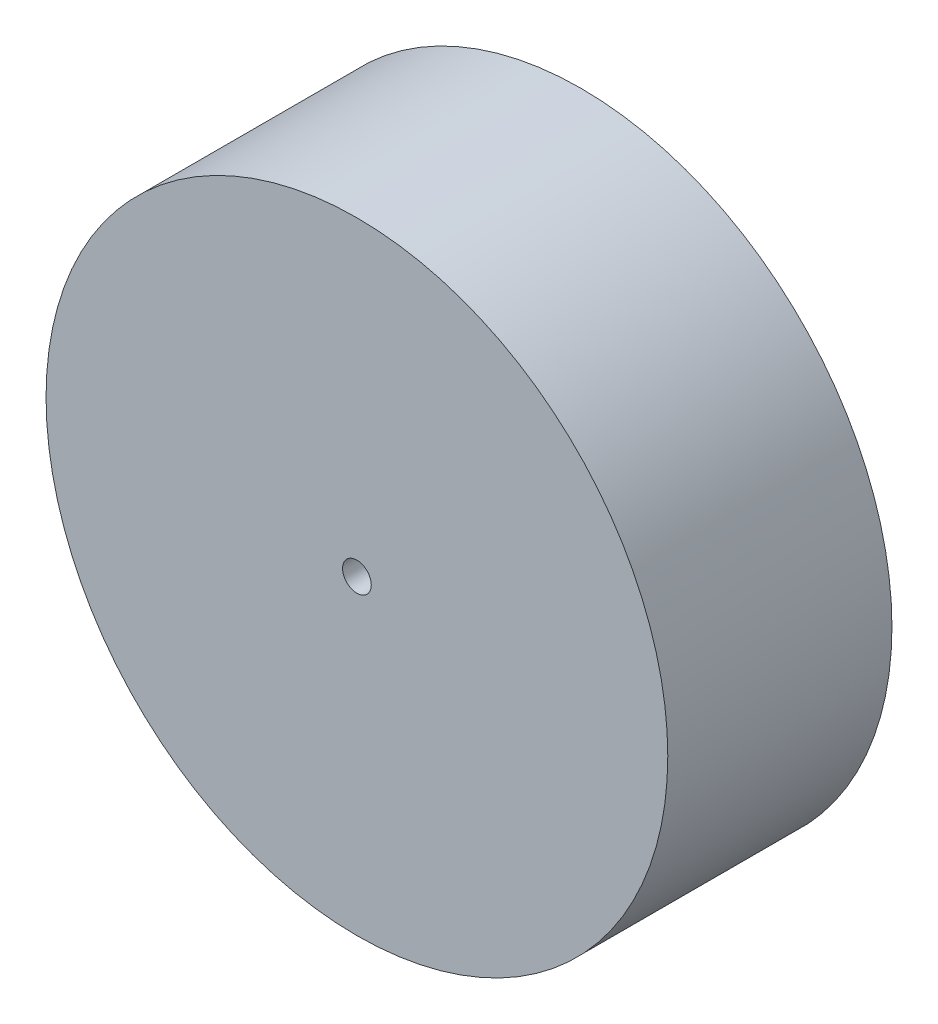
ISO-10303-21;
HEADER;
FILE_DESCRIPTION(('STEP AP214'),'2;1');
FILE_NAME('part.step','',(''),(''),'','','');
FILE_SCHEMA(('AUTOMOTIVE_DESIGN { 1 0 10303 214 1 1 1 1 }'));
ENDSEC;
DATA;
#1=APPLICATION_CONTEXT('core data for automotive mechanical design processes');
#2=APPLICATION_PROTOCOL_DEFINITION('international standard','automotive_design',2000,#1);
#3=PRODUCT_CONTEXT('',#1,'mechanical');
#4=PRODUCT('Part','Part','',(#3));
#5=PRODUCT_RELATED_PRODUCT_CATEGORY('part','',(#4));
#6=PRODUCT_DEFINITION_FORMATION('','',#4);
#7=PRODUCT_DEFINITION_CONTEXT('part definition',#1,'design');
#8=PRODUCT_DEFINITION('design','',#6,#7);
#9=PRODUCT_DEFINITION_SHAPE('','',#8);
#10=(LENGTH_UNIT() NAMED_UNIT(*) SI_UNIT(.MILLI.,.METRE.));
#11=(NAMED_UNIT(*) PLANE_ANGLE_UNIT() SI_UNIT($,.RADIAN.));
#12=(NAMED_UNIT(*) SI_UNIT($,.STERADIAN.) SOLID_ANGLE_UNIT());
#13=UNCERTAINTY_MEASURE_WITH_UNIT(LENGTH_MEASURE(1.E-05),#10,'distance_accuracy_value','');
#14=(GEOMETRIC_REPRESENTATION_CONTEXT(3) GLOBAL_UNCERTAINTY_ASSIGNED_CONTEXT((#13)) GLOBAL_UNIT_ASSIGNED_CONTEXT((#10,
#11,#12)) REPRESENTATION_CONTEXT('',''));
#15=CARTESIAN_POINT('',(0.,0.,0.));
#16=DIRECTION('',(0.,0.,1.));
#17=DIRECTION('',(1.,0.,0.));
#18=AXIS2_PLACEMENT_3D('',#15,#16,#17);
#19=CARTESIAN_POINT('',(0.,0.,25.));
#20=DIRECTION('',(0.,0.,1.));
#21=DIRECTION('',(1.,0.,0.));
#22=AXIS2_PLACEMENT_3D('',#19,#20,#21);
#23=PLANE('',#22);
#24=CARTESIAN_POINT('',(0.,0.,25.));
#25=DIRECTION('',(0.,0.,1.));
#26=DIRECTION('',(1.,0.,0.));
#27=AXIS2_PLACEMENT_3D('',#24,#25,#26);
#28=CIRCLE('',#27,34.671);
#29=CARTESIAN_POINT('',(34.671,0.,25.));
#30=VERTEX_POINT('',#29);
#31=EDGE_CURVE('E10',#30,#30,#28,.T.);
#32=ORIENTED_EDGE('',*,*,#31,.T.);
#33=EDGE_LOOP('',(#32));
#34=FACE_BOUND('',#33,.T.);
#35=CARTESIAN_POINT('',(0.,0.,25.));
#36=DIRECTION('',(0.,0.,1.));
#37=DIRECTION('',(1.,0.,0.));
#38=AXIS2_PLACEMENT_3D('',#35,#36,#37);
#39=CIRCLE('',#38,1.6);
#40=CARTESIAN_POINT('',(1.6,0.,25.));
#41=VERTEX_POINT('',#40);
#42=EDGE_CURVE('E47',#41,#41,#39,.T.);
#43=ORIENTED_EDGE('',*,*,#42,.F.);
#44=EDGE_LOOP('',(#43));
#45=FACE_BOUND('',#44,.T.);
#46=ADVANCED_FACE('F36',(#34,#45),#23,.T.);
#47=CARTESIAN_POINT('',(0.,0.,0.));
#48=DIRECTION('',(0.,0.,1.));
#49=DIRECTION('',(1.,0.,0.));
#50=AXIS2_PLACEMENT_3D('',#47,#48,#49);
#51=PLANE('',#50);
#52=CARTESIAN_POINT('',(0.,0.,0.));
#53=DIRECTION('',(0.,0.,1.));
#54=DIRECTION('',(1.,0.,0.));
#55=AXIS2_PLACEMENT_3D('',#52,#53,#54);
#56=CIRCLE('',#55,34.671);
#57=CARTESIAN_POINT('',(34.671,0.,0.));
#58=VERTEX_POINT('',#57);
#59=EDGE_CURVE('E40',#58,#58,#56,.T.);
#60=ORIENTED_EDGE('',*,*,#59,.F.);
#61=EDGE_LOOP('',(#60));
#62=FACE_BOUND('',#61,.T.);
#63=CARTESIAN_POINT('',(0.,0.,0.));
#64=DIRECTION('',(0.,0.,1.));
#65=DIRECTION('',(1.,0.,0.));
#66=AXIS2_PLACEMENT_3D('',#63,#64,#65);
#67=CIRCLE('',#66,1.6);
#68=CARTESIAN_POINT('',(1.6,0.,0.));
#69=VERTEX_POINT('',#68);
#70=EDGE_CURVE('E49',#69,#69,#67,.T.);
#71=ORIENTED_EDGE('',*,*,#70,.T.);
#72=EDGE_LOOP('',(#71));
#73=FACE_BOUND('',#72,.T.);
#74=ADVANCED_FACE('F59',(#62,#73),#51,.F.);
#75=CARTESIAN_POINT('',(0.,0.,25.));
#76=DIRECTION('',(0.,0.,-1.));
#77=DIRECTION('',(-1.,0.,0.));
#78=AXIS2_PLACEMENT_3D('',#75,#76,#77);
#79=CYLINDRICAL_SURFACE('',#78,34.671);
#80=ORIENTED_EDGE('',*,*,#31,.F.);
#81=EDGE_LOOP('',(#80));
#82=FACE_BOUND('',#81,.T.);
#83=ORIENTED_EDGE('',*,*,#59,.T.);
#84=EDGE_LOOP('',(#83));
#85=FACE_BOUND('',#84,.T.);
#86=ADVANCED_FACE('F38',(#82,#85),#79,.T.);
#87=CARTESIAN_POINT('',(0.,0.,25.));
#88=DIRECTION('',(0.,0.,-1.));
#89=DIRECTION('',(-1.,0.,0.));
#90=AXIS2_PLACEMENT_3D('',#87,#88,#89);
#91=CYLINDRICAL_SURFACE('',#90,1.6);
#92=ORIENTED_EDGE('',*,*,#42,.T.);
#93=EDGE_LOOP('',(#92));
#94=FACE_BOUND('',#93,.T.);
#95=ORIENTED_EDGE('',*,*,#70,.F.);
#96=EDGE_LOOP('',(#95));
#97=FACE_BOUND('',#96,.T.);
#98=ADVANCED_FACE('F55',(#94,#97),#91,.F.);
#99=CLOSED_SHELL('',(#46,#74,#86,#98));
#100=MANIFOLD_SOLID_BREP('B2',#99);
#101=ADVANCED_BREP_SHAPE_REPRESENTATION('',(#18,#100),#14);
#102=SHAPE_DEFINITION_REPRESENTATION(#9,#101);
ENDSEC;
END-ISO-10303-21;
